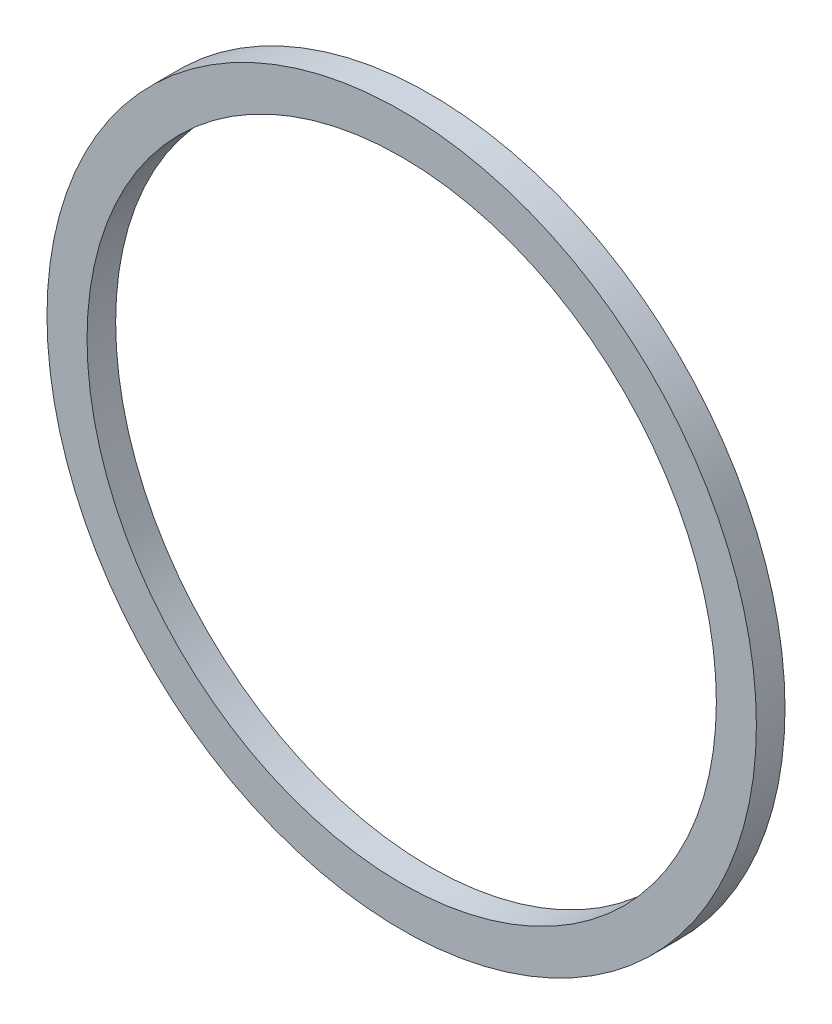
ISO-10303-21;
HEADER;
FILE_DESCRIPTION(('STEP AP214'),'2;1');
FILE_NAME('part.step','',(''),(''),'','','');
FILE_SCHEMA(('AUTOMOTIVE_DESIGN { 1 0 10303 214 1 1 1 1 }'));
ENDSEC;
DATA;
#1=APPLICATION_CONTEXT('core data for automotive mechanical design processes');
#2=APPLICATION_PROTOCOL_DEFINITION('international standard','automotive_design',2000,#1);
#3=PRODUCT_CONTEXT('',#1,'mechanical');
#4=PRODUCT('Part','Part','',(#3));
#5=PRODUCT_RELATED_PRODUCT_CATEGORY('part','',(#4));
#6=PRODUCT_DEFINITION_FORMATION('','',#4);
#7=PRODUCT_DEFINITION_CONTEXT('part definition',#1,'design');
#8=PRODUCT_DEFINITION('design','',#6,#7);
#9=PRODUCT_DEFINITION_SHAPE('','',#8);
#10=(LENGTH_UNIT() NAMED_UNIT(*) SI_UNIT(.MILLI.,.METRE.));
#11=(NAMED_UNIT(*) PLANE_ANGLE_UNIT() SI_UNIT($,.RADIAN.));
#12=(NAMED_UNIT(*) SI_UNIT($,.STERADIAN.) SOLID_ANGLE_UNIT());
#13=UNCERTAINTY_MEASURE_WITH_UNIT(LENGTH_MEASURE(1.E-05),#10,'distance_accuracy_value','');
#14=(GEOMETRIC_REPRESENTATION_CONTEXT(3) GLOBAL_UNCERTAINTY_ASSIGNED_CONTEXT((#13)) GLOBAL_UNIT_ASSIGNED_CONTEXT((#10,
#11,#12)) REPRESENTATION_CONTEXT('',''));
#15=CARTESIAN_POINT('',(0.,0.,0.));
#16=DIRECTION('',(0.,0.,1.));
#17=DIRECTION('',(1.,0.,0.));
#18=AXIS2_PLACEMENT_3D('',#15,#16,#17);
#19=CARTESIAN_POINT('',(0.,0.,2.5));
#20=DIRECTION('',(0.,0.,1.));
#21=DIRECTION('',(1.,0.,0.));
#22=AXIS2_PLACEMENT_3D('',#19,#20,#21);
#23=PLANE('',#22);
#24=CARTESIAN_POINT('',(0.,0.,2.5));
#25=DIRECTION('',(0.,0.,1.));
#26=DIRECTION('',(1.,0.,0.));
#27=AXIS2_PLACEMENT_3D('',#24,#25,#26);
#28=CIRCLE('',#27,31.);
#29=CARTESIAN_POINT('',(31.,0.,2.5));
#30=VERTEX_POINT('',#29);
#31=EDGE_CURVE('E10',#30,#30,#28,.T.);
#32=ORIENTED_EDGE('',*,*,#31,.T.);
#33=EDGE_LOOP('',(#32));
#34=FACE_BOUND('',#33,.T.);
#35=CARTESIAN_POINT('',(0.,0.,2.5));
#36=DIRECTION('',(0.,0.,1.));
#37=DIRECTION('',(1.,0.,0.));
#38=AXIS2_PLACEMENT_3D('',#35,#36,#37);
#39=CIRCLE('',#38,27.5);
#40=CARTESIAN_POINT('',(27.5,0.,2.5));
#41=VERTEX_POINT('',#40);
#42=EDGE_CURVE('E44',#41,#41,#39,.T.);
#43=ORIENTED_EDGE('',*,*,#42,.F.);
#44=EDGE_LOOP('',(#43));
#45=FACE_BOUND('',#44,.T.);
#46=ADVANCED_FACE('F33',(#34,#45),#23,.T.);
#47=CARTESIAN_POINT('',(0.,0.,0.));
#48=DIRECTION('',(0.,0.,1.));
#49=DIRECTION('',(1.,0.,0.));
#50=AXIS2_PLACEMENT_3D('',#47,#48,#49);
#51=PLANE('',#50);
#52=CARTESIAN_POINT('',(0.,0.,0.));
#53=DIRECTION('',(0.,0.,1.));
#54=DIRECTION('',(1.,0.,0.));
#55=AXIS2_PLACEMENT_3D('',#52,#53,#54);
#56=CIRCLE('',#55,31.);
#57=CARTESIAN_POINT('',(31.,0.,0.));
#58=VERTEX_POINT('',#57);
#59=EDGE_CURVE('E37',#58,#58,#56,.T.);
#60=ORIENTED_EDGE('',*,*,#59,.F.);
#61=EDGE_LOOP('',(#60));
#62=FACE_BOUND('',#61,.T.);
#63=CARTESIAN_POINT('',(0.,0.,0.));
#64=DIRECTION('',(0.,0.,1.));
#65=DIRECTION('',(1.,0.,0.));
#66=AXIS2_PLACEMENT_3D('',#63,#64,#65);
#67=CIRCLE('',#66,27.5);
#68=CARTESIAN_POINT('',(27.5,0.,0.));
#69=VERTEX_POINT('',#68);
#70=EDGE_CURVE('E46',#69,#69,#67,.T.);
#71=ORIENTED_EDGE('',*,*,#70,.T.);
#72=EDGE_LOOP('',(#71));
#73=FACE_BOUND('',#72,.T.);
#74=ADVANCED_FACE('F56',(#62,#73),#51,.F.);
#75=CARTESIAN_POINT('',(0.,0.,2.5));
#76=DIRECTION('',(0.,0.,-1.));
#77=DIRECTION('',(-1.,0.,0.));
#78=AXIS2_PLACEMENT_3D('',#75,#76,#77);
#79=CYLINDRICAL_SURFACE('',#78,31.);
#80=ORIENTED_EDGE('',*,*,#31,.F.);
#81=EDGE_LOOP('',(#80));
#82=FACE_BOUND('',#81,.T.);
#83=ORIENTED_EDGE('',*,*,#59,.T.);
#84=EDGE_LOOP('',(#83));
#85=FACE_BOUND('',#84,.T.);
#86=ADVANCED_FACE('F35',(#82,#85),#79,.T.);
#87=CARTESIAN_POINT('',(0.,0.,2.5));
#88=DIRECTION('',(0.,0.,-1.));
#89=DIRECTION('',(-1.,0.,0.));
#90=AXIS2_PLACEMENT_3D('',#87,#88,#89);
#91=CYLINDRICAL_SURFACE('',#90,27.5);
#92=ORIENTED_EDGE('',*,*,#42,.T.);
#93=EDGE_LOOP('',(#92));
#94=FACE_BOUND('',#93,.T.);
#95=ORIENTED_EDGE('',*,*,#70,.F.);
#96=EDGE_LOOP('',(#95));
#97=FACE_BOUND('',#96,.T.);
#98=ADVANCED_FACE('F52',(#94,#97),#91,.F.);
#99=CLOSED_SHELL('',(#46,#74,#86,#98));
#100=MANIFOLD_SOLID_BREP('B2',#99);
#101=ADVANCED_BREP_SHAPE_REPRESENTATION('',(#18,#100),#14);
#102=SHAPE_DEFINITION_REPRESENTATION(#9,#101);
ENDSEC;
END-ISO-10303-21;
